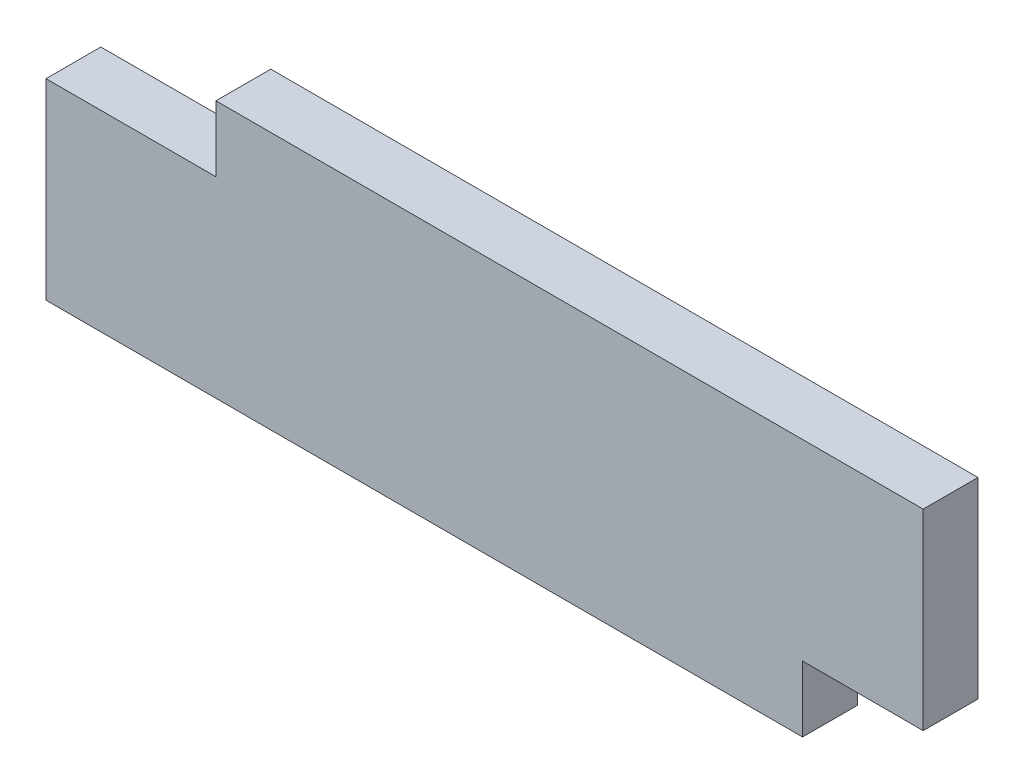
ISO-10303-21;
HEADER;
FILE_DESCRIPTION(('STEP AP214'),'2;1');
FILE_NAME('part.step','',(''),(''),'','','');
FILE_SCHEMA(('AUTOMOTIVE_DESIGN { 1 0 10303 214 1 1 1 1 }'));
ENDSEC;
DATA;
#1=APPLICATION_CONTEXT('core data for automotive mechanical design processes');
#2=APPLICATION_PROTOCOL_DEFINITION('international standard','automotive_design',2000,#1);
#3=PRODUCT_CONTEXT('',#1,'mechanical');
#4=PRODUCT('Part','Part','',(#3));
#5=PRODUCT_RELATED_PRODUCT_CATEGORY('part','',(#4));
#6=PRODUCT_DEFINITION_FORMATION('','',#4);
#7=PRODUCT_DEFINITION_CONTEXT('part definition',#1,'design');
#8=PRODUCT_DEFINITION('design','',#6,#7);
#9=PRODUCT_DEFINITION_SHAPE('','',#8);
#10=(LENGTH_UNIT() NAMED_UNIT(*) SI_UNIT(.MILLI.,.METRE.));
#11=(NAMED_UNIT(*) PLANE_ANGLE_UNIT() SI_UNIT($,.RADIAN.));
#12=(NAMED_UNIT(*) SI_UNIT($,.STERADIAN.) SOLID_ANGLE_UNIT());
#13=UNCERTAINTY_MEASURE_WITH_UNIT(LENGTH_MEASURE(1.E-05),#10,'distance_accuracy_value','');
#14=(GEOMETRIC_REPRESENTATION_CONTEXT(3) GLOBAL_UNCERTAINTY_ASSIGNED_CONTEXT((#13)) GLOBAL_UNIT_ASSIGNED_CONTEXT((#10,
#11,#12)) REPRESENTATION_CONTEXT('',''));
#15=CARTESIAN_POINT('',(0.,0.,0.));
#16=DIRECTION('',(0.,0.,1.));
#17=DIRECTION('',(1.,0.,0.));
#18=AXIS2_PLACEMENT_3D('',#15,#16,#17);
#19=CARTESIAN_POINT('',(-130.,-23.5000000000009,10.));
#20=DIRECTION('',(0.,1.,0.));
#21=DIRECTION('',(0.,0.,1.));
#22=AXIS2_PLACEMENT_3D('',#19,#20,#21);
#23=PLANE('',#22);
#24=DIRECTION('',(0.,0.,-1.));
#25=VECTOR('',#24,1.);
#26=CARTESIAN_POINT('',(7.99999999999998,-23.5000000000009,10.));
#27=LINE('',#26,#25);
#28=CARTESIAN_POINT('',(7.99999999999998,-23.5000000000009,10.));
#29=VERTEX_POINT('',#28);
#30=CARTESIAN_POINT('',(7.99999999999998,-23.5000000000009,0.));
#31=VERTEX_POINT('',#30);
#32=EDGE_CURVE('E127',#29,#31,#27,.T.);
#33=ORIENTED_EDGE('',*,*,#32,.F.);
#34=DIRECTION('',(1.,0.,0.));
#35=VECTOR('',#34,1.);
#36=CARTESIAN_POINT('',(-130.,-23.5000000000009,10.));
#37=LINE('',#36,#35);
#38=CARTESIAN_POINT('',(-130.,-23.5000000000009,10.));
#39=VERTEX_POINT('',#38);
#40=EDGE_CURVE('E149',#39,#29,#37,.T.);
#41=ORIENTED_EDGE('',*,*,#40,.F.);
#42=DIRECTION('',(0.,0.,-1.));
#43=VECTOR('',#42,1.);
#44=CARTESIAN_POINT('',(-130.,-23.5000000000009,10.));
#45=LINE('',#44,#43);
#46=CARTESIAN_POINT('',(-130.,-23.5000000000009,0.));
#47=VERTEX_POINT('',#46);
#48=EDGE_CURVE('E11',#39,#47,#45,.T.);
#49=ORIENTED_EDGE('',*,*,#48,.T.);
#50=DIRECTION('',(1.,0.,0.));
#51=VECTOR('',#50,1.);
#52=CARTESIAN_POINT('',(-130.,-23.5000000000009,0.));
#53=LINE('',#52,#51);
#54=EDGE_CURVE('E158',#47,#31,#53,.T.);
#55=ORIENTED_EDGE('',*,*,#54,.T.);
#56=EDGE_LOOP('',(#33,#41,#49,#55));
#57=FACE_BOUND('',#56,.T.);
#58=ADVANCED_FACE('F39',(#57),#23,.F.);
#59=CARTESIAN_POINT('',(30.,-23.5000000000009,10.));
#60=DIRECTION('',(-1.,0.,0.));
#61=DIRECTION('',(0.,0.,1.));
#62=AXIS2_PLACEMENT_3D('',#59,#60,#61);
#63=PLANE('',#62);
#64=DIRECTION('',(0.,0.,-1.));
#65=VECTOR('',#64,1.);
#66=CARTESIAN_POINT('',(30.,-11.5000000000082,10.));
#67=LINE('',#66,#65);
#68=CARTESIAN_POINT('',(30.,-11.5000000000082,10.));
#69=VERTEX_POINT('',#68);
#70=CARTESIAN_POINT('',(30.,-11.5000000000082,0.));
#71=VERTEX_POINT('',#70);
#72=EDGE_CURVE('E143',#69,#71,#67,.T.);
#73=ORIENTED_EDGE('',*,*,#72,.T.);
#74=DIRECTION('',(0.,1.,0.));
#75=VECTOR('',#74,1.);
#76=CARTESIAN_POINT('',(30.,-23.5000000000009,0.));
#77=LINE('',#76,#75);
#78=CARTESIAN_POINT('',(30.,23.4999999999991,0.));
#79=VERTEX_POINT('',#78);
#80=EDGE_CURVE('E162',#71,#79,#77,.T.);
#81=ORIENTED_EDGE('',*,*,#80,.T.);
#82=DIRECTION('',(0.,0.,-1.));
#83=VECTOR('',#82,1.);
#84=CARTESIAN_POINT('',(30.,23.4999999999991,10.));
#85=LINE('',#84,#83);
#86=CARTESIAN_POINT('',(30.,23.4999999999991,10.));
#87=VERTEX_POINT('',#86);
#88=EDGE_CURVE('E47',#87,#79,#85,.T.);
#89=ORIENTED_EDGE('',*,*,#88,.F.);
#90=DIRECTION('',(0.,1.,0.));
#91=VECTOR('',#90,1.);
#92=CARTESIAN_POINT('',(30.,-23.5000000000009,10.));
#93=LINE('',#92,#91);
#94=EDGE_CURVE('E154',#69,#87,#93,.T.);
#95=ORIENTED_EDGE('',*,*,#94,.F.);
#96=EDGE_LOOP('',(#73,#81,#89,#95));
#97=FACE_BOUND('',#96,.T.);
#98=ADVANCED_FACE('F187',(#97),#63,.F.);
#99=CARTESIAN_POINT('',(-130.,23.4999999999991,10.));
#100=DIRECTION('',(0.,-1.,0.));
#101=DIRECTION('',(0.,0.,-1.));
#102=AXIS2_PLACEMENT_3D('',#99,#100,#101);
#103=PLANE('',#102);
#104=DIRECTION('',(0.,0.,-1.));
#105=VECTOR('',#104,1.);
#106=CARTESIAN_POINT('',(-99.,23.4999999999991,10.));
#107=LINE('',#106,#105);
#108=CARTESIAN_POINT('',(-99.,23.4999999999991,10.));
#109=VERTEX_POINT('',#108);
#110=CARTESIAN_POINT('',(-99.,23.4999999999991,0.));
#111=VERTEX_POINT('',#110);
#112=EDGE_CURVE('E129',#109,#111,#107,.T.);
#113=ORIENTED_EDGE('',*,*,#112,.F.);
#114=DIRECTION('',(-1.,0.,0.));
#115=VECTOR('',#114,1.);
#116=CARTESIAN_POINT('',(-130.,23.4999999999991,10.));
#117=LINE('',#116,#115);
#118=EDGE_CURVE('E122',#87,#109,#117,.T.);
#119=ORIENTED_EDGE('',*,*,#118,.F.);
#120=ORIENTED_EDGE('',*,*,#88,.T.);
#121=DIRECTION('',(-1.,0.,0.));
#122=VECTOR('',#121,1.);
#123=CARTESIAN_POINT('',(-130.,23.4999999999991,0.));
#124=LINE('',#123,#122);
#125=EDGE_CURVE('E150',#79,#111,#124,.T.);
#126=ORIENTED_EDGE('',*,*,#125,.T.);
#127=EDGE_LOOP('',(#113,#119,#120,#126));
#128=FACE_BOUND('',#127,.T.);
#129=ADVANCED_FACE('F169',(#128),#103,.F.);
#130=CARTESIAN_POINT('',(0.,0.,10.));
#131=DIRECTION('',(0.,0.,-1.));
#132=DIRECTION('',(-1.,0.,0.));
#133=AXIS2_PLACEMENT_3D('',#130,#131,#132);
#134=PLANE('',#133);
#135=DIRECTION('',(0.,1.,0.));
#136=VECTOR('',#135,1.);
#137=CARTESIAN_POINT('',(-99.,-1.14491749414575E-13,10.));
#138=LINE('',#137,#136);
#139=CARTESIAN_POINT('',(-99.,11.5000000000102,10.));
#140=VERTEX_POINT('',#139);
#141=EDGE_CURVE('E106',#140,#109,#138,.T.);
#142=ORIENTED_EDGE('',*,*,#141,.F.);
#143=DIRECTION('',(-1.,0.,0.));
#144=VECTOR('',#143,1.);
#145=CARTESIAN_POINT('',(0.,11.5000000000102,10.));
#146=LINE('',#145,#144);
#147=CARTESIAN_POINT('',(-130.,11.5000000000102,10.));
#148=VERTEX_POINT('',#147);
#149=EDGE_CURVE('E111',#140,#148,#146,.T.);
#150=ORIENTED_EDGE('',*,*,#149,.T.);
#151=DIRECTION('',(0.,-1.,0.));
#152=VECTOR('',#151,1.);
#153=CARTESIAN_POINT('',(-130.,-23.5000000000009,10.));
#154=LINE('',#153,#152);
#155=EDGE_CURVE('E147',#148,#39,#154,.T.);
#156=ORIENTED_EDGE('',*,*,#155,.T.);
#157=ORIENTED_EDGE('',*,*,#40,.T.);
#158=DIRECTION('',(0.,-1.,0.));
#159=VECTOR('',#158,1.);
#160=CARTESIAN_POINT('',(7.99999999999998,0.,10.));
#161=LINE('',#160,#159);
#162=CARTESIAN_POINT('',(7.99999999999998,-11.5000000000082,10.));
#163=VERTEX_POINT('',#162);
#164=EDGE_CURVE('E133',#163,#29,#161,.T.);
#165=ORIENTED_EDGE('',*,*,#164,.F.);
#166=DIRECTION('',(-1.,0.,0.));
#167=VECTOR('',#166,1.);
#168=CARTESIAN_POINT('',(0.,-11.5000000000082,10.));
#169=LINE('',#168,#167);
#170=EDGE_CURVE('E135',#69,#163,#169,.T.);
#171=ORIENTED_EDGE('',*,*,#170,.F.);
#172=ORIENTED_EDGE('',*,*,#94,.T.);
#173=ORIENTED_EDGE('',*,*,#118,.T.);
#174=EDGE_LOOP('',(#142,#150,#156,#157,#165,#171,#172,#173));
#175=FACE_BOUND('',#174,.T.);
#176=ADVANCED_FACE('F120',(#175),#134,.F.);
#177=CARTESIAN_POINT('',(0.,0.,0.));
#178=DIRECTION('',(0.,0.,-1.));
#179=DIRECTION('',(-1.,0.,0.));
#180=AXIS2_PLACEMENT_3D('',#177,#178,#179);
#181=PLANE('',#180);
#182=DIRECTION('',(-1.,0.,0.));
#183=VECTOR('',#182,1.);
#184=CARTESIAN_POINT('',(0.,11.5000000000102,0.));
#185=LINE('',#184,#183);
#186=CARTESIAN_POINT('',(-99.,11.5000000000102,0.));
#187=VERTEX_POINT('',#186);
#188=CARTESIAN_POINT('',(-130.,11.5000000000102,0.));
#189=VERTEX_POINT('',#188);
#190=EDGE_CURVE('E123',#187,#189,#185,.T.);
#191=ORIENTED_EDGE('',*,*,#190,.F.);
#192=DIRECTION('',(0.,1.,0.));
#193=VECTOR('',#192,1.);
#194=CARTESIAN_POINT('',(-99.,-1.14491749414575E-13,0.));
#195=LINE('',#194,#193);
#196=EDGE_CURVE('E54',#187,#111,#195,.T.);
#197=ORIENTED_EDGE('',*,*,#196,.T.);
#198=ORIENTED_EDGE('',*,*,#125,.F.);
#199=ORIENTED_EDGE('',*,*,#80,.F.);
#200=DIRECTION('',(-1.,0.,0.));
#201=VECTOR('',#200,1.);
#202=CARTESIAN_POINT('',(0.,-11.5000000000082,0.));
#203=LINE('',#202,#201);
#204=CARTESIAN_POINT('',(7.99999999999998,-11.5000000000082,0.));
#205=VERTEX_POINT('',#204);
#206=EDGE_CURVE('E136',#71,#205,#203,.T.);
#207=ORIENTED_EDGE('',*,*,#206,.T.);
#208=DIRECTION('',(0.,-1.,0.));
#209=VECTOR('',#208,1.);
#210=CARTESIAN_POINT('',(7.99999999999998,0.,0.));
#211=LINE('',#210,#209);
#212=EDGE_CURVE('E62',#205,#31,#211,.T.);
#213=ORIENTED_EDGE('',*,*,#212,.T.);
#214=ORIENTED_EDGE('',*,*,#54,.F.);
#215=DIRECTION('',(0.,-1.,0.));
#216=VECTOR('',#215,1.);
#217=CARTESIAN_POINT('',(-130.,-23.5000000000009,0.));
#218=LINE('',#217,#216);
#219=EDGE_CURVE('E131',#189,#47,#218,.T.);
#220=ORIENTED_EDGE('',*,*,#219,.F.);
#221=EDGE_LOOP('',(#191,#197,#198,#199,#207,#213,#214,#220));
#222=FACE_BOUND('',#221,.T.);
#223=ADVANCED_FACE('F174',(#222),#181,.T.);
#224=CARTESIAN_POINT('',(-130.,-23.5000000000009,10.));
#225=DIRECTION('',(1.,0.,0.));
#226=DIRECTION('',(0.,0.,-1.));
#227=AXIS2_PLACEMENT_3D('',#224,#225,#226);
#228=PLANE('',#227);
#229=ORIENTED_EDGE('',*,*,#155,.F.);
#230=DIRECTION('',(0.,0.,-1.));
#231=VECTOR('',#230,1.);
#232=CARTESIAN_POINT('',(-130.,11.5000000000102,10.));
#233=LINE('',#232,#231);
#234=EDGE_CURVE('E110',#148,#189,#233,.T.);
#235=ORIENTED_EDGE('',*,*,#234,.T.);
#236=ORIENTED_EDGE('',*,*,#219,.T.);
#237=ORIENTED_EDGE('',*,*,#48,.F.);
#238=EDGE_LOOP('',(#229,#235,#236,#237));
#239=FACE_BOUND('',#238,.T.);
#240=ADVANCED_FACE('F41',(#239),#228,.F.);
#241=CARTESIAN_POINT('',(7.99999999999998,0.,10.));
#242=DIRECTION('',(1.,0.,0.));
#243=DIRECTION('',(0.,0.,-1.));
#244=AXIS2_PLACEMENT_3D('',#241,#242,#243);
#245=PLANE('',#244);
#246=ORIENTED_EDGE('',*,*,#212,.F.);
#247=DIRECTION('',(0.,0.,-1.));
#248=VECTOR('',#247,1.);
#249=CARTESIAN_POINT('',(7.99999999999998,-11.5000000000082,10.));
#250=LINE('',#249,#248);
#251=EDGE_CURVE('E138',#163,#205,#250,.T.);
#252=ORIENTED_EDGE('',*,*,#251,.F.);
#253=ORIENTED_EDGE('',*,*,#164,.T.);
#254=ORIENTED_EDGE('',*,*,#32,.T.);
#255=EDGE_LOOP('',(#246,#252,#253,#254));
#256=FACE_BOUND('',#255,.T.);
#257=ADVANCED_FACE('F183',(#256),#245,.T.);
#258=CARTESIAN_POINT('',(0.,-11.5000000000082,10.));
#259=DIRECTION('',(0.,-1.,0.));
#260=DIRECTION('',(0.,0.,-1.));
#261=AXIS2_PLACEMENT_3D('',#258,#259,#260);
#262=PLANE('',#261);
#263=ORIENTED_EDGE('',*,*,#206,.F.);
#264=ORIENTED_EDGE('',*,*,#72,.F.);
#265=ORIENTED_EDGE('',*,*,#170,.T.);
#266=ORIENTED_EDGE('',*,*,#251,.T.);
#267=EDGE_LOOP('',(#263,#264,#265,#266));
#268=FACE_BOUND('',#267,.T.);
#269=ADVANCED_FACE('F185',(#268),#262,.T.);
#270=CARTESIAN_POINT('',(-99.,-1.14491749414575E-13,10.));
#271=DIRECTION('',(-1.,0.,0.));
#272=DIRECTION('',(0.,-1.,0.));
#273=AXIS2_PLACEMENT_3D('',#270,#271,#272);
#274=PLANE('',#273);
#275=ORIENTED_EDGE('',*,*,#196,.F.);
#276=DIRECTION('',(0.,0.,-1.));
#277=VECTOR('',#276,1.);
#278=CARTESIAN_POINT('',(-99.,11.5000000000102,10.));
#279=LINE('',#278,#277);
#280=EDGE_CURVE('E102',#140,#187,#279,.T.);
#281=ORIENTED_EDGE('',*,*,#280,.F.);
#282=ORIENTED_EDGE('',*,*,#141,.T.);
#283=ORIENTED_EDGE('',*,*,#112,.T.);
#284=EDGE_LOOP('',(#275,#281,#282,#283));
#285=FACE_BOUND('',#284,.T.);
#286=ADVANCED_FACE('F104',(#285),#274,.T.);
#287=CARTESIAN_POINT('',(0.,11.5000000000102,10.));
#288=DIRECTION('',(0.,-1.,0.));
#289=DIRECTION('',(0.,0.,-1.));
#290=AXIS2_PLACEMENT_3D('',#287,#288,#289);
#291=PLANE('',#290);
#292=ORIENTED_EDGE('',*,*,#190,.T.);
#293=ORIENTED_EDGE('',*,*,#234,.F.);
#294=ORIENTED_EDGE('',*,*,#149,.F.);
#295=ORIENTED_EDGE('',*,*,#280,.T.);
#296=EDGE_LOOP('',(#292,#293,#294,#295));
#297=FACE_BOUND('',#296,.T.);
#298=ADVANCED_FACE('F114',(#297),#291,.F.);
#299=CLOSED_SHELL('',(#58,#98,#129,#176,#223,#240,#257,#269,#286,#298));
#300=MANIFOLD_SOLID_BREP('B2',#299);
#301=ADVANCED_BREP_SHAPE_REPRESENTATION('',(#18,#300),#14);
#302=SHAPE_DEFINITION_REPRESENTATION(#9,#301);
ENDSEC;
END-ISO-10303-21;
